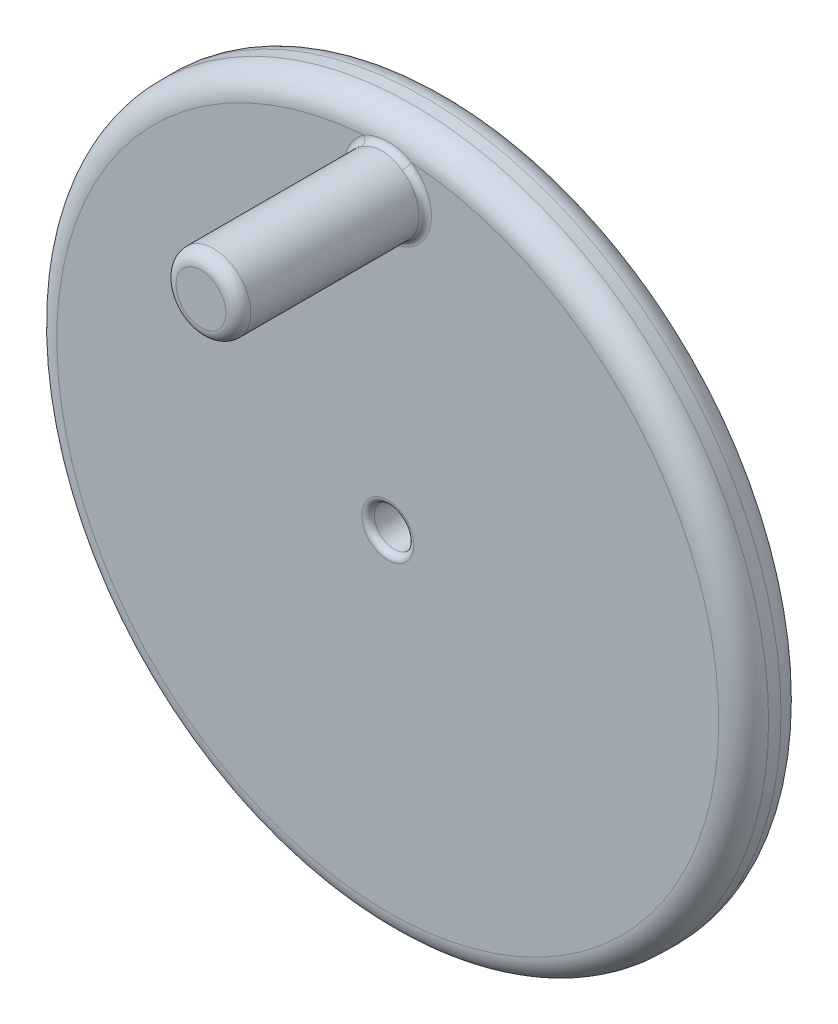
ISO-10303-21;
HEADER;
FILE_DESCRIPTION(('STEP AP214'),'2;1');
FILE_NAME('part.step','',(''),(''),'','','');
FILE_SCHEMA(('AUTOMOTIVE_DESIGN { 1 0 10303 214 1 1 1 1 }'));
ENDSEC;
DATA;
#1=APPLICATION_CONTEXT('core data for automotive mechanical design processes');
#2=APPLICATION_PROTOCOL_DEFINITION('international standard','automotive_design',2000,#1);
#3=PRODUCT_CONTEXT('',#1,'mechanical');
#4=PRODUCT('Part','Part','',(#3));
#5=PRODUCT_RELATED_PRODUCT_CATEGORY('part','',(#4));
#6=PRODUCT_DEFINITION_FORMATION('','',#4);
#7=PRODUCT_DEFINITION_CONTEXT('part definition',#1,'design');
#8=PRODUCT_DEFINITION('design','',#6,#7);
#9=PRODUCT_DEFINITION_SHAPE('','',#8);
#10=(LENGTH_UNIT() NAMED_UNIT(*) SI_UNIT(.MILLI.,.METRE.));
#11=(NAMED_UNIT(*) PLANE_ANGLE_UNIT() SI_UNIT($,.RADIAN.));
#12=(NAMED_UNIT(*) SI_UNIT($,.STERADIAN.) SOLID_ANGLE_UNIT());
#13=UNCERTAINTY_MEASURE_WITH_UNIT(LENGTH_MEASURE(1.E-05),#10,'distance_accuracy_value','');
#14=(GEOMETRIC_REPRESENTATION_CONTEXT(3) GLOBAL_UNCERTAINTY_ASSIGNED_CONTEXT((#13)) GLOBAL_UNIT_ASSIGNED_CONTEXT((#10,
#11,#12)) REPRESENTATION_CONTEXT('',''));
#15=CARTESIAN_POINT('',(0.,0.,0.));
#16=DIRECTION('',(0.,0.,1.));
#17=DIRECTION('',(1.,0.,0.));
#18=AXIS2_PLACEMENT_3D('',#15,#16,#17);
#19=CARTESIAN_POINT('',(0.,0.,5.));
#20=DIRECTION('',(0.,0.,1.));
#21=DIRECTION('',(1.,0.,0.));
#22=AXIS2_PLACEMENT_3D('',#19,#20,#21);
#23=PLANE('',#22);
#24=CARTESIAN_POINT('',(0.,0.,5.));
#25=DIRECTION('',(0.,0.,1.));
#26=DIRECTION('',(1.,0.,0.));
#27=AXIS2_PLACEMENT_3D('',#24,#25,#26);
#28=CIRCLE('',#27,4.175);
#29=CARTESIAN_POINT('',(4.175,0.,5.));
#30=VERTEX_POINT('',#29);
#31=EDGE_CURVE('E87',#30,#30,#28,.F.);
#32=ORIENTED_EDGE('',*,*,#31,.T.);
#33=EDGE_LOOP('',(#32));
#34=FACE_BOUND('',#33,.T.);
#35=CARTESIAN_POINT('',(0.,0.,5.));
#36=DIRECTION('',(0.,0.,1.));
#37=DIRECTION('',(1.,0.,0.));
#38=AXIS2_PLACEMENT_3D('',#35,#36,#37);
#39=CIRCLE('',#38,53.15);
#40=CARTESIAN_POINT('',(-3.82560975573013,53.0121420996819,5.));
#41=VERTEX_POINT('',#40);
#42=CARTESIAN_POINT('',(3.82560975573012,53.0121420996819,5.));
#43=VERTEX_POINT('',#42);
#44=EDGE_CURVE('E85',#41,#43,#39,.T.);
#45=ORIENTED_EDGE('',*,*,#44,.T.);
#46=CARTESIAN_POINT('',(0.,47.15,5.));
#47=DIRECTION('',(0.,0.,1.));
#48=DIRECTION('',(1.,0.,0.));
#49=AXIS2_PLACEMENT_3D('',#46,#47,#48);
#50=CIRCLE('',#49,7.);
#51=EDGE_CURVE('E83',#43,#41,#50,.F.);
#52=ORIENTED_EDGE('',*,*,#51,.T.);
#53=EDGE_LOOP('',(#45,#52));
#54=FACE_BOUND('',#53,.T.);
#55=ADVANCED_FACE('F45',(#34,#54),#23,.T.);
#56=CARTESIAN_POINT('',(0.,0.,-5.));
#57=DIRECTION('',(0.,0.,1.));
#58=DIRECTION('',(1.,0.,0.));
#59=AXIS2_PLACEMENT_3D('',#56,#57,#58);
#60=PLANE('',#59);
#61=CARTESIAN_POINT('',(0.,0.,-5.));
#62=DIRECTION('',(0.,0.,1.));
#63=DIRECTION('',(1.,0.,0.));
#64=AXIS2_PLACEMENT_3D('',#61,#62,#63);
#65=CIRCLE('',#64,4.175);
#66=CARTESIAN_POINT('',(4.175,0.,-5.));
#67=VERTEX_POINT('',#66);
#68=EDGE_CURVE('E172',#67,#67,#65,.T.);
#69=ORIENTED_EDGE('',*,*,#68,.T.);
#70=EDGE_LOOP('',(#69));
#71=FACE_BOUND('',#70,.T.);
#72=CARTESIAN_POINT('',(0.,0.,-5.));
#73=DIRECTION('',(0.,0.,1.));
#74=DIRECTION('',(1.,0.,0.));
#75=AXIS2_PLACEMENT_3D('',#72,#73,#74);
#76=CIRCLE('',#75,53.15);
#77=CARTESIAN_POINT('',(53.15,0.,-5.));
#78=VERTEX_POINT('',#77);
#79=EDGE_CURVE('E93',#78,#78,#76,.F.);
#80=ORIENTED_EDGE('',*,*,#79,.T.);
#81=EDGE_LOOP('',(#80));
#82=FACE_BOUND('',#81,.T.);
#83=ADVANCED_FACE('F142',(#71,#82),#60,.F.);
#84=CARTESIAN_POINT('',(0.,0.,5.));
#85=DIRECTION('',(0.,0.,-1.));
#86=DIRECTION('',(-1.,0.,0.));
#87=AXIS2_PLACEMENT_3D('',#84,#85,#86);
#88=CYLINDRICAL_SURFACE('',#87,57.15);
#89=CARTESIAN_POINT('',(0.,0.,-1.));
#90=DIRECTION('',(0.,0.,1.));
#91=DIRECTION('',(1.,0.,0.));
#92=AXIS2_PLACEMENT_3D('',#89,#90,#91);
#93=CIRCLE('',#92,57.15);
#94=CARTESIAN_POINT('',(57.15,0.,-1.));
#95=VERTEX_POINT('',#94);
#96=EDGE_CURVE('E161',#95,#95,#93,.T.);
#97=ORIENTED_EDGE('',*,*,#96,.T.);
#98=EDGE_LOOP('',(#97));
#99=FACE_BOUND('',#98,.T.);
#100=CARTESIAN_POINT('',(0.,0.,1.));
#101=DIRECTION('',(0.,0.,1.));
#102=DIRECTION('',(1.,0.,0.));
#103=AXIS2_PLACEMENT_3D('',#100,#101,#102);
#104=CIRCLE('',#103,57.15);
#105=CARTESIAN_POINT('',(57.15,0.,1.));
#106=VERTEX_POINT('',#105);
#107=EDGE_CURVE('E98',#106,#106,#104,.F.);
#108=ORIENTED_EDGE('',*,*,#107,.T.);
#109=EDGE_LOOP('',(#108));
#110=FACE_BOUND('',#109,.T.);
#111=ADVANCED_FACE('F138',(#99,#110),#88,.T.);
#112=CARTESIAN_POINT('',(0.,0.,5.));
#113=DIRECTION('',(0.,0.,-1.));
#114=DIRECTION('',(-1.,0.,0.));
#115=AXIS2_PLACEMENT_3D('',#112,#113,#114);
#116=CYLINDRICAL_SURFACE('',#115,3.175);
#117=CARTESIAN_POINT('',(0.,0.,-4.));
#118=DIRECTION('',(0.,0.,1.));
#119=DIRECTION('',(1.,0.,0.));
#120=AXIS2_PLACEMENT_3D('',#117,#118,#119);
#121=CIRCLE('',#120,3.175);
#122=CARTESIAN_POINT('',(3.175,0.,-4.));
#123=VERTEX_POINT('',#122);
#124=EDGE_CURVE('E88',#123,#123,#121,.F.);
#125=ORIENTED_EDGE('',*,*,#124,.T.);
#126=EDGE_LOOP('',(#125));
#127=FACE_BOUND('',#126,.T.);
#128=CARTESIAN_POINT('',(0.,0.,4.));
#129=DIRECTION('',(0.,0.,1.));
#130=DIRECTION('',(1.,0.,0.));
#131=AXIS2_PLACEMENT_3D('',#128,#129,#130);
#132=CIRCLE('',#131,3.175);
#133=CARTESIAN_POINT('',(3.175,0.,4.));
#134=VERTEX_POINT('',#133);
#135=EDGE_CURVE('E175',#134,#134,#132,.T.);
#136=ORIENTED_EDGE('',*,*,#135,.T.);
#137=EDGE_LOOP('',(#136));
#138=FACE_BOUND('',#137,.T.);
#139=ADVANCED_FACE('F133',(#127,#138),#116,.F.);
#140=CARTESIAN_POINT('',(0.,0.,-1.));
#141=DIRECTION('',(0.,0.,1.));
#142=DIRECTION('',(1.,0.,0.));
#143=AXIS2_PLACEMENT_3D('',#140,#141,#142);
#144=TOROIDAL_SURFACE('',#143,53.15,4.);
#145=ORIENTED_EDGE('',*,*,#79,.F.);
#146=EDGE_LOOP('',(#145));
#147=FACE_BOUND('',#146,.T.);
#148=ORIENTED_EDGE('',*,*,#96,.F.);
#149=EDGE_LOOP('',(#148));
#150=FACE_BOUND('',#149,.T.);
#151=ADVANCED_FACE('F137',(#147,#150),#144,.T.);
#152=CARTESIAN_POINT('',(0.,0.,1.));
#153=DIRECTION('',(0.,0.,1.));
#154=DIRECTION('',(1.,0.,0.));
#155=AXIS2_PLACEMENT_3D('',#152,#153,#154);
#156=TOROIDAL_SURFACE('',#155,53.15,4.);
#157=ORIENTED_EDGE('',*,*,#107,.F.);
#158=EDGE_LOOP('',(#157));
#159=FACE_BOUND('',#158,.T.);
#160=ORIENTED_EDGE('',*,*,#44,.F.);
#161=CARTESIAN_POINT('',(4.55296655434113,51.0577481437589,5.86145955393285));
#162=CARTESIAN_POINT('',(4.42677022591093,51.2047810746147,4.69061250424505));
#163=CARTESIAN_POINT('',(5.3356825589254,51.9415858232002,4.88916764314628));
#164=CARTESIAN_POINT('',(4.46142982697786,51.1644484109321,5.88859310665438));
#165=CARTESIAN_POINT('',(4.34947471232873,51.2879677861052,4.72924155396515));
#166=CARTESIAN_POINT('',(5.22604754033177,52.0436594217996,4.91087448413568));
#167=CARTESIAN_POINT('',(4.36568947580493,51.2683627158147,5.91079869866899));
#168=CARTESIAN_POINT('',(4.26696585484307,51.3723691467716,4.76472312578439));
#169=CARTESIAN_POINT('',(5.11171783946394,52.1431267722381,4.92863895768286));
#170=CARTESIAN_POINT('',(4.16665415029211,51.4695939397444,5.94688983201179));
#171=CARTESIAN_POINT('',(4.09280874420459,51.5401535863445,4.82880656124213));
#172=CARTESIAN_POINT('',(4.87467341656386,52.3358434436375,4.9575118648863));
#173=CARTESIAN_POINT('',(4.06336818107032,51.5669184641945,5.96078511476118));
#174=CARTESIAN_POINT('',(4.00135948315573,51.6235111015841,4.85750844397666));
#175=CARTESIAN_POINT('',(4.75196870061145,52.4290999305747,4.96862809167876));
#176=CARTESIAN_POINT('',(3.85014094152466,51.7539669315993,5.98182175508578));
#177=CARTESIAN_POINT('',(3.80963056526013,51.7873429153689,4.90834676159235));
#178=CARTESIAN_POINT('',(4.49923130412189,52.6084102933108,4.98545740419849));
#179=CARTESIAN_POINT('',(3.74021684208009,51.8437091556787,5.98897980536203));
#180=CARTESIAN_POINT('',(3.70950793840036,51.8678703841824,4.93060157044161));
#181=CARTESIAN_POINT('',(4.36921758537303,52.6944814866814,4.99118384408889));
#182=CARTESIAN_POINT('',(3.51415019413809,52.0152739966524,5.99806960357919));
#183=CARTESIAN_POINT('',(3.50080143438836,52.0245612001445,4.96930727524495));
#184=CARTESIAN_POINT('',(4.10235102423178,52.8590928311539,4.99845568258736));
#185=CARTESIAN_POINT('',(3.39800498666995,52.0970931845194,5.99999909830456));
#186=CARTESIAN_POINT('',(3.39228157209365,52.1008314479959,4.98585291386507));
#187=CARTESIAN_POINT('',(3.96549525916484,52.9376297213334,4.99999927862324));
#188=CARTESIAN_POINT('',(3.12619952612137,52.2744706478618,6.00000115939167));
#189=CARTESIAN_POINT('',(3.13587439636815,52.2681528500238,5.01790075074364));
#190=CARTESIAN_POINT('',(3.64574626742242,53.107949427552,5.00000092753958));
#191=CARTESIAN_POINT('',(2.96873255582979,52.3672727341801,5.99681385714328));
#192=CARTESIAN_POINT('',(2.98494868507545,52.3579068343154,5.03198956184524));
#193=CARTESIAN_POINT('',(3.4608738402587,53.1971031994909,4.99745108537831));
#194=CARTESIAN_POINT('',(2.64605330174435,52.5381117369477,5.98670514780103));
#195=CARTESIAN_POINT('',(2.67211117619484,52.5250843166725,5.05383569957185));
#196=CARTESIAN_POINT('',(3.08267462815756,53.3612834009319,4.98936411784846));
#197=CARTESIAN_POINT('',(2.48083931487919,52.6161453875984,5.97978291608869));
#198=CARTESIAN_POINT('',(2.5100441300186,52.6028705843344,5.06171299412797));
#199=CARTESIAN_POINT('',(2.88934598487502,53.4363067056944,4.98382633278524));
#200=CARTESIAN_POINT('',(2.14387273862807,52.7568866474054,5.96449402078964));
#201=CARTESIAN_POINT('',(2.17678843264355,52.7442023055566,5.07311642281126));
#202=CARTESIAN_POINT('',(2.49555474968842,53.5716553631832,4.97159521671751));
#203=CARTESIAN_POINT('',(1.97211412556863,52.8195797230647,5.9561260001817));
#204=CARTESIAN_POINT('',(2.00529350266718,52.8080973009938,5.07670959929698));
#205=CARTESIAN_POINT('',(2.29508559729219,53.6319667778551,4.9649008000956));
#206=CARTESIAN_POINT('',(1.62359920660558,52.929037906774,5.93988042488045));
#207=CARTESIAN_POINT('',(1.65544046998219,52.920088106921,5.08131274358671));
#208=CARTESIAN_POINT('',(1.88871175764464,53.7372876198495,4.95190433983064));
#209=CARTESIAN_POINT('',(1.44684360610423,52.9758052509482,5.93200280145775));
#210=CARTESIAN_POINT('',(1.47666884194885,52.968503307184,5.0823559355639));
#211=CARTESIAN_POINT('',(1.68280783786464,53.7822991954134,4.94560224120404));
#212=CARTESIAN_POINT('',(1.10442999064112,53.0498600817739,5.918800072189));
#213=CARTESIAN_POINT('',(1.1292218822987,53.0452744886304,5.08325782293476));
#214=CARTESIAN_POINT('',(1.28419383050067,53.8535828994322,4.93504005771646));
#215=CARTESIAN_POINT('',(0.93905306361107,53.0784321563524,5.91331844730055));
#216=CARTESIAN_POINT('',(0.960610683067097,53.0751265035107,5.0832144681673));
#217=CARTESIAN_POINT('',(1.09178931984567,53.8810906426936,4.93065475764509));
#218=CARTESIAN_POINT('',(0.606446303600332,53.1216279992319,5.90482647511191));
#219=CARTESIAN_POINT('',(0.621142516940155,53.120223177017,5.08293890761688));
#220=CARTESIAN_POINT('',(0.704965968611152,53.9226799216222,4.92386117972033));
#221=CARTESIAN_POINT('',(0.439216596406155,53.1362527086298,5.9018159610757));
#222=CARTESIAN_POINT('',(0.449850799841798,53.1355876160989,5.08270712719566));
#223=CARTESIAN_POINT('',(0.510547264834062,53.93676236316,4.92145276847812));
#224=CARTESIAN_POINT('',(0.104122236889672,53.1514402684418,5.89868683168542));
#225=CARTESIAN_POINT('',(0.106798924565861,53.1515017844321,5.08246422603297));
#226=CARTESIAN_POINT('',(0.121021151310049,53.9513868186691,4.91894946506338));
#227=CARTESIAN_POINT('',(-0.063742328898146,53.15200497079,5.89856783547096));
#228=CARTESIAN_POINT('',(-0.0654189603236179,53.1520961269034,5.08245243295514));
#229=CARTESIAN_POINT('',(-0.0740861643494475,53.9519306159022,4.91885426820252));
#230=CARTESIAN_POINT('',(-0.398908475569818,53.1390731389193,5.90123688796528));
#231=CARTESIAN_POINT('',(-0.408584532624857,53.1385437709099,5.08266404828914));
#232=CARTESIAN_POINT('',(-0.46368840526478,53.9394781964464,4.92098951034786));
#233=CARTESIAN_POINT('',(-0.566210067039528,53.1255768705941,5.90402488170271));
#234=CARTESIAN_POINT('',(-0.579990897278607,53.124360998583,5.08288802608352));
#235=CARTESIAN_POINT('',(-0.658183342030975,53.9264822357949,4.92321990537698));
#236=CARTESIAN_POINT('',(-0.898030317294183,53.0847548262093,5.91209490386096));
#237=CARTESIAN_POINT('',(-0.918772432149433,53.081724577391,5.08319383221136));
#238=CARTESIAN_POINT('',(-1.0440700794113,53.8871779162312,4.92967592307405));
#239=CARTESIAN_POINT('',(-1.06255973645947,53.0575140974456,5.91736158149011));
#240=CARTESIAN_POINT('',(-1.08660062043751,53.0532470990705,5.08327638048843));
#241=CARTESIAN_POINT('',(-1.23547358162494,53.8609514247099,4.93388926510931));
#242=CARTESIAN_POINT('',(-1.3888112258036,52.9894336087128,5.92962973854211));
#243=CARTESIAN_POINT('',(-1.41776779823389,52.9826361599414,5.08257965695047));
#244=CARTESIAN_POINT('',(-1.61523357739653,53.7954168727936,4.94370379077917));
#245=CARTESIAN_POINT('',(-1.55053194568367,52.9485874884223,5.93663202894609));
#246=CARTESIAN_POINT('',(-1.58149275224916,52.9403183100702,5.0817934860683));
#247=CARTESIAN_POINT('',(-1.80358860257103,53.756102694101,4.94930562319874));
#248=CARTESIAN_POINT('',(-1.86972223832813,52.8536671333155,5.95126039957931));
#249=CARTESIAN_POINT('',(-1.90256117495786,52.8429566384041,5.07833965254647));
#250=CARTESIAN_POINT('',(-2.17565302185315,53.6647632634237,4.96100831962165));
#251=CARTESIAN_POINT('',(-2.02719847163999,52.7996151471462,5.95888541643077));
#252=CARTESIAN_POINT('',(-2.06024381543193,52.7877019218068,5.07565396999565));
#253=CARTESIAN_POINT('',(-2.35936966201656,53.6127593906439,4.96710833292322));
#254=CARTESIAN_POINT('',(-2.33713223033819,52.6786055308316,5.97337853733339));
#255=CARTESIAN_POINT('',(-2.3680745404826,52.6655246196016,5.06715589797786));
#256=CARTESIAN_POINT('',(-2.72133846020718,53.496368646777,4.97870282970687));
#257=CARTESIAN_POINT('',(-2.48959033337162,52.6116493922352,5.98024672871945));
#258=CARTESIAN_POINT('',(-2.51847232597091,52.5983357156586,5.06129857498862));
#259=CARTESIAN_POINT('',(-2.89959124702602,53.4319832068366,4.98419738305683));
#260=CARTESIAN_POINT('',(-2.74931963319366,52.4844478242794,5.99008159065264));
#261=CARTESIAN_POINT('',(-2.77171945531216,52.4728564650286,5.0472193744869));
#262=CARTESIAN_POINT('',(-3.20367727877429,53.3097084569651,4.99206527246212));
#263=CARTESIAN_POINT('',(-2.85797201360297,52.4270341515486,5.99359893332224));
#264=CARTESIAN_POINT('',(-2.8771156216741,52.4165450124654,5.03996293314928));
#265=CARTESIAN_POINT('',(-3.33101737452614,53.2545309068305,4.99487914636212));
#266=CARTESIAN_POINT('',(-3.07146258269989,52.3056934586953,5.99855692820806));
#267=CARTESIAN_POINT('',(-3.08250239624576,52.299023455575,5.0224084166002));
#268=CARTESIAN_POINT('',(-3.58152127481415,53.1379499530358,4.99884554230406));
#269=CARTESIAN_POINT('',(-3.17630481618643,52.2417736368106,5.99999984933593));
#270=CARTESIAN_POINT('',(-3.18253043829114,52.237710581072,5.01207147682842));
#271=CARTESIAN_POINT('',(-3.70468949810966,53.0765534302463,4.99999987947477));
#272=CARTESIAN_POINT('',(-3.39766869522304,52.0973112735896,6.00000017380157));
#273=CARTESIAN_POINT('',(-3.39195393858635,52.1010409726795,4.98589132266047));
#274=CARTESIAN_POINT('',(-3.96509975148588,52.9378391135333,5.0000001390343));
#275=CARTESIAN_POINT('',(-3.51351137318914,52.0157234503532,5.99808041829838));
#276=CARTESIAN_POINT('',(-3.5001987195722,52.0249834320371,4.96939837431043));
#277=CARTESIAN_POINT('',(-4.10159832533225,52.8595242502772,4.99846433425958));
#278=CARTESIAN_POINT('',(-3.73906532763267,51.8446181335924,5.98904085629731));
#279=CARTESIAN_POINT('',(-3.70845033002217,51.868694887067,4.93081854154541));
#280=CARTESIAN_POINT('',(-4.36785684461644,52.6953534435837,4.99123268476273));
#281=CARTESIAN_POINT('',(-3.84877561901757,51.7550993719964,5.98192021691094));
#282=CARTESIAN_POINT('',(-3.80838768326239,51.7883559294069,4.90863445733642));
#283=CARTESIAN_POINT('',(-4.49761570716689,52.6094962942346,4.98553617372994));
#284=CARTESIAN_POINT('',(-4.06213025363798,51.568069074978,5.96094322112523));
#285=CARTESIAN_POINT('',(-4.00026286717584,51.6244976080647,4.85784130121555));
#286=CARTESIAN_POINT('',(-4.7504987032557,52.4302025357434,4.96875457669751));
#287=CARTESIAN_POINT('',(-4.16572386698895,51.4705034389903,5.94703755341098));
#288=CARTESIAN_POINT('',(-4.09199319544482,51.5409180917425,4.82908463517828));
#289=CARTESIAN_POINT('',(-4.87356681873676,52.3367146762995,4.95763004163592));
#290=CARTESIAN_POINT('',(-4.36527803438266,51.2688097260457,5.91089413731297));
#291=CARTESIAN_POINT('',(-4.26661498050814,51.3727286963916,4.76487476323337));
#292=CARTESIAN_POINT('',(-5.11122648433923,52.1435546530192,4.9287153079676));
#293=CARTESIAN_POINT('',(-4.4612339104426,51.1646776961978,5.88865132946355));
#294=CARTESIAN_POINT('',(-4.3493120810965,51.2881441607566,4.72932433526427));
#295=CARTESIAN_POINT('',(-5.2258128365626,52.0438787646332,4.91092106178896));
#296=CARTESIAN_POINT('',(-4.55296655434114,51.0577481437589,5.86145955393285));
#297=CARTESIAN_POINT('',(-4.42677022591093,51.2047810746147,4.69061250424505));
#298=CARTESIAN_POINT('',(-5.33568255892541,51.9415858232002,4.88916764314628));
#299=(BOUNDED_SURFACE() B_SPLINE_SURFACE(3,2,((#161,#162,#163),(#164,#165,#166),(#167,#168,
#169),(#170,#171,#172),(#173,#174,#175),(#176,#177,#178),(#179,#180,#181),(#182,#183,#184),
(#185,#186,#187),(#188,#189,#190),(#191,#192,#193),(#194,#195,#196),(#197,#198,#199),(#200,#201,
#202),(#203,#204,#205),(#206,#207,#208),(#209,#210,#211),(#212,#213,#214),(#215,#216,#217),
(#218,#219,#220),(#221,#222,#223),(#224,#225,#226),(#227,#228,#229),(#230,#231,#232),(#233,#234,
#235),(#236,#237,#238),(#239,#240,#241),(#242,#243,#244),(#245,#246,#247),(#248,#249,#250),
(#251,#252,#253),(#254,#255,#256),(#257,#258,#259),(#260,#261,#262),(#263,#264,#265),(#266,#267,
#268),(#269,#270,#271),(#272,#273,#274),(#275,#276,#277),(#278,#279,#280),(#281,#282,#283),
(#284,#285,#286),(#287,#288,#289),(#290,#291,#292),(#293,#294,#295),(#296,#297,#298)),
.UNSPECIFIED.,.F.,.F.,.F.) B_SPLINE_SURFACE_WITH_KNOTS((4,2,2,2,2,2,2,2,2,2,2,2,2,2,2,2,2,2,2,2,
2,2,4),(3,3),(0.,0.498431452846402,0.996277488716458,1.4928867492959,1.9897099867332,
2.62852071667778,3.26747254455194,3.90702738501085,4.54649238881907,5.13342898635122,
5.72032597759921,6.30714566445716,6.8939542547248,7.47717555090526,8.06066987806853,
8.64318785830472,9.22563854753135,9.65561397245469,10.0851187503139,10.5805826272492,
11.076125866977,11.5753254344326,12.074828437242),(0.,1.),
.UNSPECIFIED.) GEOMETRIC_REPRESENTATION_ITEM() RATIONAL_B_SPLINE_SURFACE(((1.,0.644366947628928,
1.),(1.,0.649404631523238,1.),(1.,0.654618227932558,1.),(1.,0.665197702270251,1.),(1.,
0.670563394149035,1.),(1.,0.681246970449272,1.),(1.,0.686564940522099,1.),(1.,0.697011482772143,
1.),(1.,0.70213997235511,1.),(1.,0.713493058107635,1.),(1.,0.719612035050869,1.),(1.,
0.731091062183364,1.),(1.,0.736450944445433,1.),(1.,0.746246867214907,1.),(1.,0.750682031070175,
1.),(1.,0.758494559178274,1.),(1.,0.76187207193003,1.),(1.,0.767249036010748,1.),(1.,
0.769338896836556,1.),(1.,0.772506150370131,1.),(1.,0.773583611389391,1.),(1.,0.774702641040008,
1.),(1.,0.774744346097449,1.),(1.,0.773791345889954,1.),(1.,0.772796660223221,1.),(1.,
0.769801746817951,1.),(1.,0.767807703359242,1.),(1.,0.762859344033473,1.),(1.,0.759904579058591,
1.),(1.,0.753106798979727,1.),(1.,0.749265278436078,1.),(1.,0.740780852317717,1.),(1.,
0.736138039368246,1.),(1.,0.727475399541797,1.),(1.,0.72361065773006,1.),(1.,0.715573001671634,
1.),(1.,0.711400429378057,1.),(1.,0.70215375693903,1.),(1.,0.697039614086458,1.),(1.,
0.686619530206022,1.),(1.,0.681313558587376,1.),(1.,0.670627217645039,1.),(1.,0.665246588246679,
1.),(1.,0.654640671669565,1.),(1.,0.649415480902616,1.),(1.,0.644366947628928,1.))) REPRESENTATION_ITEM('') SURFACE());
#300=CARTESIAN_POINT('',(-5.33568255892541,51.9415858232002,4.88916764314628));
#301=CARTESIAN_POINT('',(-5.2258128365626,52.0438787646332,4.91092106178896));
#302=CARTESIAN_POINT('',(-5.11122648433923,52.1435546530192,4.9287153079676));
#303=CARTESIAN_POINT('',(-4.87356681873676,52.3367146762995,4.95763004163592));
#304=CARTESIAN_POINT('',(-4.7504987032557,52.4302025357434,4.96875457669752));
#305=CARTESIAN_POINT('',(-4.49761570716689,52.6094962942346,4.98553617372994));
#306=CARTESIAN_POINT('',(-4.36785684461644,52.6953534435837,4.99123268476273));
#307=CARTESIAN_POINT('',(-4.10159832533225,52.8595242502772,4.99846433425958));
#308=CARTESIAN_POINT('',(-3.96509975148588,52.9378391135333,5.0000001390343));
#309=CARTESIAN_POINT('',(-3.70468949810966,53.0765534302463,4.99999987947477));
#310=CARTESIAN_POINT('',(-3.58152127481415,53.1379499530358,4.99884554230406));
#311=CARTESIAN_POINT('',(-3.33101737452614,53.2545309068305,4.99487914636212));
#312=CARTESIAN_POINT('',(-3.20367727877429,53.3097084569651,4.99206527246212));
#313=CARTESIAN_POINT('',(-2.89959124702602,53.4319832068366,4.98419738305683));
#314=CARTESIAN_POINT('',(-2.72133846020718,53.496368646777,4.97870282970687));
#315=CARTESIAN_POINT('',(-2.35936966201656,53.6127593906439,4.96710833292322));
#316=CARTESIAN_POINT('',(-2.17565302185315,53.6647632634237,4.96100831962165));
#317=CARTESIAN_POINT('',(-1.80358860257103,53.756102694101,4.94930562319874));
#318=CARTESIAN_POINT('',(-1.61523357739653,53.7954168727936,4.94370379077917));
#319=CARTESIAN_POINT('',(-1.23547358162494,53.8609514247099,4.93388926510931));
#320=CARTESIAN_POINT('',(-1.0440700794113,53.8871779162312,4.92967592307405));
#321=CARTESIAN_POINT('',(-0.658183342030975,53.9264822357949,4.92321990537698));
#322=CARTESIAN_POINT('',(-0.46368840526478,53.9394781964464,4.92098951034786));
#323=CARTESIAN_POINT('',(-0.0740861643494474,53.9519306159022,4.91885426820252));
#324=CARTESIAN_POINT('',(0.121021151310049,53.9513868186691,4.91894946506338));
#325=CARTESIAN_POINT('',(0.510547264834062,53.93676236316,4.92145276847812));
#326=CARTESIAN_POINT('',(0.704965968611152,53.9226799216222,4.92386117972033));
#327=CARTESIAN_POINT('',(1.09178931984567,53.8810906426936,4.93065475764508));
#328=CARTESIAN_POINT('',(1.28419383050067,53.8535828994322,4.93504005771646));
#329=CARTESIAN_POINT('',(1.68280783786464,53.7822991954134,4.94560224120404));
#330=CARTESIAN_POINT('',(1.88871175764464,53.7372876198495,4.95190433983064));
#331=CARTESIAN_POINT('',(2.29508559729219,53.6319667778551,4.9649008000956));
#332=CARTESIAN_POINT('',(2.49555474968842,53.5716553631832,4.97159521671751));
#333=CARTESIAN_POINT('',(2.88934598487502,53.4363067056944,4.98382633278524));
#334=CARTESIAN_POINT('',(3.08267462815756,53.3612834009319,4.98936411784846));
#335=CARTESIAN_POINT('',(3.4608738402587,53.1971031994909,4.99745108537831));
#336=CARTESIAN_POINT('',(3.64574626742242,53.107949427552,5.00000092753958));
#337=CARTESIAN_POINT('',(3.96549525916484,52.9376297213334,4.99999927862324));
#338=CARTESIAN_POINT('',(4.10235102423178,52.8590928311539,4.99845568258736));
#339=CARTESIAN_POINT('',(4.36921758537303,52.6944814866814,4.99118384408889));
#340=CARTESIAN_POINT('',(4.49923130412189,52.6084102933108,4.98545740419849));
#341=CARTESIAN_POINT('',(4.75196870061145,52.4290999305747,4.96862809167876));
#342=CARTESIAN_POINT('',(4.87467341656386,52.3358434436375,4.9575118648863));
#343=CARTESIAN_POINT('',(5.11171783946394,52.1431267722381,4.92863895768286));
#344=CARTESIAN_POINT('',(5.22604754033177,52.0436594217996,4.91087448413568));
#345=CARTESIAN_POINT('',(5.3356825589254,51.9415858232002,4.88916764314628));
#346=B_SPLINE_CURVE_WITH_KNOTS('',3,(#300,#301,#302,#303,#304,#305,#306,#307,#308,#309,#310,
#311,#312,#313,#314,#315,#316,#317,#318,#319,#320,#321,#322,#323,#324,#325,#326,#327,#328,#329,
#330,#331,#332,#333,#334,#335,#336,#337,#338,#339,#340,#341,#342,#343,#344,#345),.UNSPECIFIED.,
.F.,.F.,(4,2,2,2,2,2,2,2,2,2,2,2,2,2,2,2,2,2,2,2,2,2,4),(0.,0.499503002809315,0.998702570265003,
1.49424580999274,1.98970968692805,2.41921446478726,2.8491898897106,3.43164057893723,
4.01415855917342,4.59765288633669,5.18087418251715,5.76768277278479,6.35450245964274,
6.94139945089073,7.52833604842288,8.1678010522311,8.80735589269001,9.44630772056417,
10.0851184505088,10.5819416879461,11.0785509485255,11.5763969843956,12.074828437242),.UNSPECIFIED.);
#347=EDGE_CURVE('E11',#41,#43,#346,.T.);
#348=ORIENTED_EDGE('',*,*,#347,.T.);
#349=EDGE_LOOP('',(#160,#348));
#350=FACE_BOUND('',#349,.T.);
#351=ADVANCED_FACE('F91',(#159,#350),#156,.T.);
#352=CARTESIAN_POINT('',(0.,47.15,35.));
#353=DIRECTION('',(0.,0.,-1.));
#354=DIRECTION('',(-1.,0.,0.));
#355=AXIS2_PLACEMENT_3D('',#352,#353,#354);
#356=CYLINDRICAL_SURFACE('',#355,6.);
#357=CARTESIAN_POINT('',(0.,47.15,6.));
#358=DIRECTION('',(0.,0.,1.));
#359=DIRECTION('',(1.,0.,0.));
#360=AXIS2_PLACEMENT_3D('',#357,#358,#359);
#361=CIRCLE('',#360,6.);
#362=CARTESIAN_POINT('',(-3.27909407634011,52.1746932282987,6.));
#363=VERTEX_POINT('',#362);
#364=CARTESIAN_POINT('',(3.2790940763401,52.1746932282988,6.));
#365=VERTEX_POINT('',#364);
#366=EDGE_CURVE('E66',#363,#365,#361,.T.);
#367=ORIENTED_EDGE('',*,*,#366,.T.);
#368=CARTESIAN_POINT('',(4.55296655434113,51.0577481437589,5.86145955393285));
#369=CARTESIAN_POINT('',(4.46142982697785,51.1644484109321,5.88859310665438));
#370=CARTESIAN_POINT('',(4.36568947580493,51.2683627158146,5.91079869866899));
#371=CARTESIAN_POINT('',(4.16665415029211,51.4695939397444,5.94688983201179));
#372=CARTESIAN_POINT('',(4.06336818107032,51.5669184641945,5.96078511476118));
#373=CARTESIAN_POINT('',(3.85014094152466,51.7539669315993,5.98182175508578));
#374=CARTESIAN_POINT('',(3.74021684208009,51.8437091556787,5.98897980536203));
#375=CARTESIAN_POINT('',(3.51415019413809,52.0152739966524,5.99806960357919));
#376=CARTESIAN_POINT('',(3.39800498666995,52.0970931845193,5.99999909830456));
#377=CARTESIAN_POINT('',(3.12619952612137,52.2744706478618,6.00000115939167));
#378=CARTESIAN_POINT('',(2.96873255582979,52.3672727341801,5.99681385714328));
#379=CARTESIAN_POINT('',(2.64605330174435,52.5381117369477,5.98670514780103));
#380=CARTESIAN_POINT('',(2.48083931487919,52.6161453875984,5.97978291608869));
#381=CARTESIAN_POINT('',(2.14387273862807,52.7568866474054,5.96449402078964));
#382=CARTESIAN_POINT('',(1.97211412556863,52.8195797230647,5.9561260001817));
#383=CARTESIAN_POINT('',(1.62359920660558,52.929037906774,5.93988042488045));
#384=CARTESIAN_POINT('',(1.44684360610423,52.9758052509483,5.93200280145775));
#385=CARTESIAN_POINT('',(1.10442999064112,53.0498600817739,5.918800072189));
#386=CARTESIAN_POINT('',(0.93905306361107,53.0784321563524,5.91331844730055));
#387=CARTESIAN_POINT('',(0.606446303600332,53.1216279992319,5.90482647511191));
#388=CARTESIAN_POINT('',(0.439216596406155,53.1362527086298,5.9018159610757));
#389=CARTESIAN_POINT('',(0.104122236889672,53.1514402684418,5.89868683168542));
#390=CARTESIAN_POINT('',(-0.063742328898146,53.15200497079,5.89856783547096));
#391=CARTESIAN_POINT('',(-0.398908475569818,53.1390731389192,5.90123688796528));
#392=CARTESIAN_POINT('',(-0.566210067039528,53.1255768705941,5.90402488170271));
#393=CARTESIAN_POINT('',(-0.898030317294183,53.0847548262093,5.91209490386096));
#394=CARTESIAN_POINT('',(-1.06255973645947,53.0575140974456,5.91736158149011));
#395=CARTESIAN_POINT('',(-1.3888112258036,52.9894336087128,5.92962973854211));
#396=CARTESIAN_POINT('',(-1.55053194568367,52.9485874884223,5.93663202894609));
#397=CARTESIAN_POINT('',(-1.86972223832813,52.8536671333155,5.95126039957931));
#398=CARTESIAN_POINT('',(-2.02719847163999,52.7996151471462,5.95888541643077));
#399=CARTESIAN_POINT('',(-2.33713223033819,52.6786055308316,5.97337853733339));
#400=CARTESIAN_POINT('',(-2.48959033337162,52.6116493922352,5.98024672871945));
#401=CARTESIAN_POINT('',(-2.74931963319366,52.4844478242794,5.99008159065264));
#402=CARTESIAN_POINT('',(-2.85797201360297,52.4270341515486,5.99359893332224));
#403=CARTESIAN_POINT('',(-3.07146258269989,52.3056934586953,5.99855692820806));
#404=CARTESIAN_POINT('',(-3.17630481618643,52.2417736368106,5.99999984933593));
#405=CARTESIAN_POINT('',(-3.39766869522304,52.0973112735896,6.00000017380157));
#406=CARTESIAN_POINT('',(-3.51351137318914,52.0157234503532,5.99808041829838));
#407=CARTESIAN_POINT('',(-3.73906532763267,51.8446181335924,5.98904085629731));
#408=CARTESIAN_POINT('',(-3.84877561901757,51.7550993719964,5.98192021691094));
#409=CARTESIAN_POINT('',(-4.06213025363798,51.568069074978,5.96094322112523));
#410=CARTESIAN_POINT('',(-4.16572386698895,51.4705034389903,5.94703755341098));
#411=CARTESIAN_POINT('',(-4.36527803438266,51.2688097260457,5.91089413731296));
#412=CARTESIAN_POINT('',(-4.4612339104426,51.1646776961978,5.88865132946355));
#413=CARTESIAN_POINT('',(-4.55296655434114,51.0577481437589,5.86145955393285));
#414=B_SPLINE_CURVE_WITH_KNOTS('',3,(#368,#369,#370,#371,#372,#373,#374,#375,#376,#377,#378,
#379,#380,#381,#382,#383,#384,#385,#386,#387,#388,#389,#390,#391,#392,#393,#394,#395,#396,#397,
#398,#399,#400,#401,#402,#403,#404,#405,#406,#407,#408,#409,#410,#411,#412,#413),.UNSPECIFIED.,
.F.,.F.,(4,2,2,2,2,2,2,2,2,2,2,2,2,2,2,2,2,2,2,2,2,2,4),(0.,0.498431452846402,0.996277488716458,
1.4928867492959,1.9897099867332,2.62852071667778,3.26747254455194,3.90702738501085,
4.54649238881907,5.13342898635122,5.72032597759921,6.30714566445716,6.8939542547248,
7.47717555090526,8.06066987806853,8.64318785830472,9.22563854753135,9.65561397245469,
10.0851187503139,10.5805826272492,11.076125866977,11.5753254344326,12.074828437242),.UNSPECIFIED.);
#415=EDGE_CURVE('E59',#365,#363,#414,.T.);
#416=ORIENTED_EDGE('',*,*,#415,.T.);
#417=EDGE_LOOP('',(#367,#416));
#418=FACE_BOUND('',#417,.T.);
#419=CARTESIAN_POINT('',(0.,47.15,33.));
#420=DIRECTION('',(0.,0.,1.));
#421=DIRECTION('',(1.,0.,0.));
#422=AXIS2_PLACEMENT_3D('',#419,#420,#421);
#423=CIRCLE('',#422,6.);
#424=CARTESIAN_POINT('',(6.,47.15,33.));
#425=VERTEX_POINT('',#424);
#426=EDGE_CURVE('E169',#425,#425,#423,.F.);
#427=ORIENTED_EDGE('',*,*,#426,.T.);
#428=EDGE_LOOP('',(#427));
#429=FACE_BOUND('',#428,.T.);
#430=ADVANCED_FACE('F127',(#418,#429),#356,.T.);
#431=CARTESIAN_POINT('',(0.,47.15,35.));
#432=DIRECTION('',(0.,0.,1.));
#433=DIRECTION('',(1.,0.,0.));
#434=AXIS2_PLACEMENT_3D('',#431,#432,#433);
#435=PLANE('',#434);
#436=CARTESIAN_POINT('',(0.,47.15,35.));
#437=DIRECTION('',(0.,0.,1.));
#438=DIRECTION('',(1.,0.,0.));
#439=AXIS2_PLACEMENT_3D('',#436,#437,#438);
#440=CIRCLE('',#439,4.);
#441=CARTESIAN_POINT('',(4.,47.15,35.));
#442=VERTEX_POINT('',#441);
#443=EDGE_CURVE('E92',#442,#442,#440,.T.);
#444=ORIENTED_EDGE('',*,*,#443,.T.);
#445=EDGE_LOOP('',(#444));
#446=FACE_BOUND('',#445,.T.);
#447=ADVANCED_FACE('F132',(#446),#435,.T.);
#448=CARTESIAN_POINT('',(0.,47.15,33.));
#449=DIRECTION('',(0.,0.,1.));
#450=DIRECTION('',(1.,0.,0.));
#451=AXIS2_PLACEMENT_3D('',#448,#449,#450);
#452=TOROIDAL_SURFACE('',#451,4.,2.);
#453=ORIENTED_EDGE('',*,*,#426,.F.);
#454=EDGE_LOOP('',(#453));
#455=FACE_BOUND('',#454,.T.);
#456=ORIENTED_EDGE('',*,*,#443,.F.);
#457=EDGE_LOOP('',(#456));
#458=FACE_BOUND('',#457,.T.);
#459=ADVANCED_FACE('F184',(#455,#458),#452,.T.);
#460=CARTESIAN_POINT('',(0.,0.,-4.));
#461=DIRECTION('',(0.,0.,1.));
#462=DIRECTION('',(1.,0.,0.));
#463=AXIS2_PLACEMENT_3D('',#460,#461,#462);
#464=TOROIDAL_SURFACE('',#463,4.175,1.);
#465=ORIENTED_EDGE('',*,*,#124,.F.);
#466=EDGE_LOOP('',(#465));
#467=FACE_BOUND('',#466,.T.);
#468=ORIENTED_EDGE('',*,*,#68,.F.);
#469=EDGE_LOOP('',(#468));
#470=FACE_BOUND('',#469,.T.);
#471=ADVANCED_FACE('F120',(#467,#470),#464,.T.);
#472=CARTESIAN_POINT('',(0.,0.,4.));
#473=DIRECTION('',(0.,0.,1.));
#474=DIRECTION('',(1.,0.,0.));
#475=AXIS2_PLACEMENT_3D('',#472,#473,#474);
#476=TOROIDAL_SURFACE('',#475,4.175,1.);
#477=ORIENTED_EDGE('',*,*,#31,.F.);
#478=EDGE_LOOP('',(#477));
#479=FACE_BOUND('',#478,.T.);
#480=ORIENTED_EDGE('',*,*,#135,.F.);
#481=EDGE_LOOP('',(#480));
#482=FACE_BOUND('',#481,.T.);
#483=ADVANCED_FACE('F124',(#479,#482),#476,.T.);
#484=CARTESIAN_POINT('',(0.,47.15,6.));
#485=DIRECTION('',(0.,0.,1.));
#486=DIRECTION('',(1.,0.,0.));
#487=AXIS2_PLACEMENT_3D('',#484,#485,#486);
#488=TOROIDAL_SURFACE('',#487,7.,1.);
#489=CARTESIAN_POINT('',(-3.82560975573013,53.0121420996819,6.));
#490=DIRECTION('',(-0.837448871383123,-0.546515679390019,0.));
#491=DIRECTION('',(0.546515679390019,-0.837448871383123,0.));
#492=AXIS2_PLACEMENT_3D('',#489,#490,#491);
#493=CIRCLE('',#492,1.);
#494=EDGE_CURVE('E74',#41,#363,#493,.T.);
#495=ORIENTED_EDGE('',*,*,#494,.F.);
#496=ORIENTED_EDGE('',*,*,#51,.F.);
#497=CARTESIAN_POINT('',(3.82560975573012,53.0121420996819,6.));
#498=DIRECTION('',(0.837448871383124,-0.546515679390017,0.));
#499=DIRECTION('',(0.546515679390018,0.837448871383124,0.));
#500=AXIS2_PLACEMENT_3D('',#497,#498,#499);
#501=CIRCLE('',#500,1.);
#502=EDGE_CURVE('E96',#365,#43,#501,.T.);
#503=ORIENTED_EDGE('',*,*,#502,.F.);
#504=ORIENTED_EDGE('',*,*,#366,.F.);
#505=EDGE_LOOP('',(#495,#496,#503,#504));
#506=FACE_BOUND('',#505,.T.);
#507=ADVANCED_FACE('F47',(#506),#488,.F.);
#508=ORIENTED_EDGE('',*,*,#502,.T.);
#509=ORIENTED_EDGE('',*,*,#347,.F.);
#510=ORIENTED_EDGE('',*,*,#494,.T.);
#511=ORIENTED_EDGE('',*,*,#415,.F.);
#512=EDGE_LOOP('',(#508,#509,#510,#511));
#513=FACE_BOUND('',#512,.T.);
#514=ADVANCED_FACE('F95',(#513),#299,.F.);
#515=CLOSED_SHELL('',(#55,#83,#111,#139,#151,#351,#430,#447,#459,#471,#483,#507,#514));
#516=MANIFOLD_SOLID_BREP('B2',#515);
#517=ADVANCED_BREP_SHAPE_REPRESENTATION('',(#18,#516),#14);
#518=SHAPE_DEFINITION_REPRESENTATION(#9,#517);
ENDSEC;
END-ISO-10303-21;
